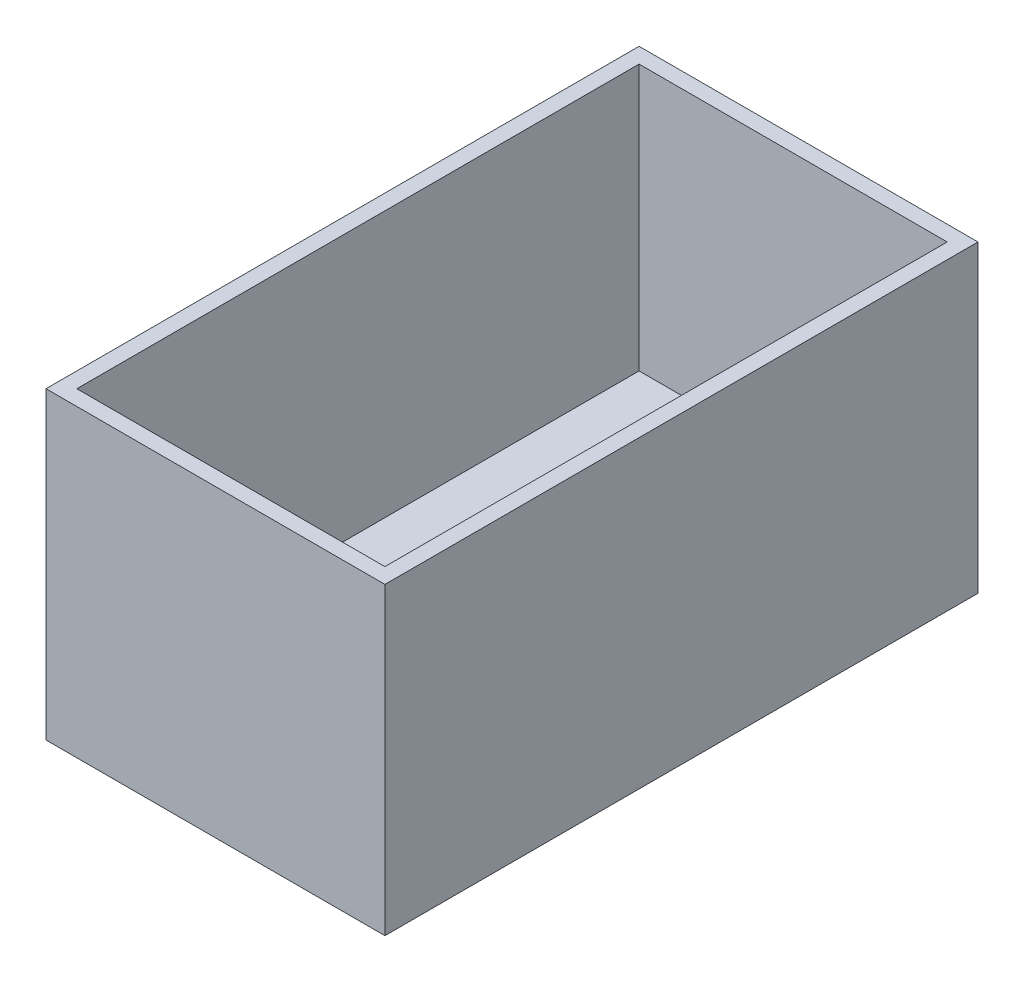
ISO-10303-21;
HEADER;
FILE_DESCRIPTION(('STEP AP214'),'2;1');
FILE_NAME('part.step','',(''),(''),'','','');
FILE_SCHEMA(('AUTOMOTIVE_DESIGN { 1 0 10303 214 1 1 1 1 }'));
ENDSEC;
DATA;
#1=APPLICATION_CONTEXT('core data for automotive mechanical design processes');
#2=APPLICATION_PROTOCOL_DEFINITION('international standard','automotive_design',2000,#1);
#3=PRODUCT_CONTEXT('',#1,'mechanical');
#4=PRODUCT('Part','Part','',(#3));
#5=PRODUCT_RELATED_PRODUCT_CATEGORY('part','',(#4));
#6=PRODUCT_DEFINITION_FORMATION('','',#4);
#7=PRODUCT_DEFINITION_CONTEXT('part definition',#1,'design');
#8=PRODUCT_DEFINITION('design','',#6,#7);
#9=PRODUCT_DEFINITION_SHAPE('','',#8);
#10=(LENGTH_UNIT() NAMED_UNIT(*) SI_UNIT(.MILLI.,.METRE.));
#11=(NAMED_UNIT(*) PLANE_ANGLE_UNIT() SI_UNIT($,.RADIAN.));
#12=(NAMED_UNIT(*) SI_UNIT($,.STERADIAN.) SOLID_ANGLE_UNIT());
#13=UNCERTAINTY_MEASURE_WITH_UNIT(LENGTH_MEASURE(1.E-05),#10,'distance_accuracy_value','');
#14=(GEOMETRIC_REPRESENTATION_CONTEXT(3) GLOBAL_UNCERTAINTY_ASSIGNED_CONTEXT((#13)) GLOBAL_UNIT_ASSIGNED_CONTEXT((#10,
#11,#12)) REPRESENTATION_CONTEXT('',''));
#15=CARTESIAN_POINT('',(0.,0.,0.));
#16=DIRECTION('',(0.,0.,1.));
#17=DIRECTION('',(1.,0.,0.));
#18=AXIS2_PLACEMENT_3D('',#15,#16,#17);
#19=CARTESIAN_POINT('',(4.171875,-37.9739583333333,26.5));
#20=DIRECTION('',(0.,1.,0.));
#21=DIRECTION('',(-1.,0.,0.));
#22=AXIS2_PLACEMENT_3D('',#19,#20,#21);
#23=CYLINDRICAL_SURFACE('',#22,2.75);
#24=CARTESIAN_POINT('',(4.171875,-32.9739583333333,26.5));
#25=DIRECTION('',(0.,1.,0.));
#26=DIRECTION('',(-1.,0.,0.));
#27=AXIS2_PLACEMENT_3D('',#24,#25,#26);
#28=CIRCLE('',#27,2.75);
#29=CARTESIAN_POINT('',(1.421875,-32.9739583333333,26.5));
#30=VERTEX_POINT('',#29);
#31=EDGE_CURVE('E328',#30,#30,#28,.T.);
#32=ORIENTED_EDGE('',*,*,#31,.F.);
#33=EDGE_LOOP('',(#32));
#34=FACE_BOUND('',#33,.T.);
#35=CARTESIAN_POINT('',(4.171875,-30.9739583333333,26.5));
#36=DIRECTION('',(0.,1.,0.));
#37=DIRECTION('',(-1.,0.,0.));
#38=AXIS2_PLACEMENT_3D('',#35,#36,#37);
#39=CIRCLE('',#38,2.75);
#40=CARTESIAN_POINT('',(1.421875,-30.9739583333333,26.5));
#41=VERTEX_POINT('',#40);
#42=EDGE_CURVE('E334',#41,#41,#39,.T.);
#43=ORIENTED_EDGE('',*,*,#42,.T.);
#44=EDGE_LOOP('',(#43));
#45=FACE_BOUND('',#44,.T.);
#46=ADVANCED_FACE('F46',(#34,#45),#23,.F.);
#47=CARTESIAN_POINT('',(4.17187500000001,-37.9739583333333,46.5));
#48=DIRECTION('',(0.,1.,0.));
#49=DIRECTION('',(-1.,0.,0.));
#50=AXIS2_PLACEMENT_3D('',#47,#48,#49);
#51=CYLINDRICAL_SURFACE('',#50,2.75);
#52=CARTESIAN_POINT('',(4.171875,-32.9739583333333,46.5));
#53=DIRECTION('',(0.,1.,0.));
#54=DIRECTION('',(-1.,0.,0.));
#55=AXIS2_PLACEMENT_3D('',#52,#53,#54);
#56=CIRCLE('',#55,2.75);
#57=CARTESIAN_POINT('',(1.421875,-32.9739583333333,46.5));
#58=VERTEX_POINT('',#57);
#59=EDGE_CURVE('E355',#58,#58,#56,.T.);
#60=ORIENTED_EDGE('',*,*,#59,.F.);
#61=EDGE_LOOP('',(#60));
#62=FACE_BOUND('',#61,.T.);
#63=CARTESIAN_POINT('',(4.171875,-30.9739583333333,46.5));
#64=DIRECTION('',(0.,1.,0.));
#65=DIRECTION('',(-1.,0.,0.));
#66=AXIS2_PLACEMENT_3D('',#63,#64,#65);
#67=CIRCLE('',#66,2.75);
#68=CARTESIAN_POINT('',(1.421875,-30.9739583333333,46.5));
#69=VERTEX_POINT('',#68);
#70=EDGE_CURVE('E318',#69,#69,#67,.T.);
#71=ORIENTED_EDGE('',*,*,#70,.T.);
#72=EDGE_LOOP('',(#71));
#73=FACE_BOUND('',#72,.T.);
#74=ADVANCED_FACE('F199',(#62,#73),#51,.F.);
#75=CARTESIAN_POINT('',(4.171875,-37.9739583333333,11.5));
#76=DIRECTION('',(0.,1.,0.));
#77=DIRECTION('',(-1.,0.,0.));
#78=AXIS2_PLACEMENT_3D('',#75,#76,#77);
#79=CYLINDRICAL_SURFACE('',#78,2.75);
#80=CARTESIAN_POINT('',(4.171875,-32.9739583333333,11.5));
#81=DIRECTION('',(0.,1.,0.));
#82=DIRECTION('',(-1.,0.,0.));
#83=AXIS2_PLACEMENT_3D('',#80,#81,#82);
#84=CIRCLE('',#83,2.75);
#85=CARTESIAN_POINT('',(1.421875,-32.9739583333333,11.5));
#86=VERTEX_POINT('',#85);
#87=EDGE_CURVE('E357',#86,#86,#84,.T.);
#88=ORIENTED_EDGE('',*,*,#87,.F.);
#89=EDGE_LOOP('',(#88));
#90=FACE_BOUND('',#89,.T.);
#91=CARTESIAN_POINT('',(4.171875,-30.9739583333333,11.5));
#92=DIRECTION('',(0.,1.,0.));
#93=DIRECTION('',(-1.,0.,0.));
#94=AXIS2_PLACEMENT_3D('',#91,#92,#93);
#95=CIRCLE('',#94,2.75);
#96=CARTESIAN_POINT('',(1.421875,-30.9739583333333,11.5));
#97=VERTEX_POINT('',#96);
#98=EDGE_CURVE('E342',#97,#97,#95,.T.);
#99=ORIENTED_EDGE('',*,*,#98,.T.);
#100=EDGE_LOOP('',(#99));
#101=FACE_BOUND('',#100,.T.);
#102=ADVANCED_FACE('F205',(#90,#101),#79,.F.);
#103=CARTESIAN_POINT('',(4.17187500000001,-37.9739583333333,61.5));
#104=DIRECTION('',(0.,1.,0.));
#105=DIRECTION('',(-1.,0.,0.));
#106=AXIS2_PLACEMENT_3D('',#103,#104,#105);
#107=CYLINDRICAL_SURFACE('',#106,2.75);
#108=CARTESIAN_POINT('',(4.17187500000001,-32.9739583333333,61.5));
#109=DIRECTION('',(0.,1.,0.));
#110=DIRECTION('',(-1.,0.,0.));
#111=AXIS2_PLACEMENT_3D('',#108,#109,#110);
#112=CIRCLE('',#111,2.75);
#113=CARTESIAN_POINT('',(1.42187500000001,-32.9739583333333,61.5));
#114=VERTEX_POINT('',#113);
#115=EDGE_CURVE('E132',#114,#114,#112,.T.);
#116=ORIENTED_EDGE('',*,*,#115,.F.);
#117=EDGE_LOOP('',(#116));
#118=FACE_BOUND('',#117,.T.);
#119=CARTESIAN_POINT('',(4.17187500000001,-30.9739583333333,61.5));
#120=DIRECTION('',(0.,1.,0.));
#121=DIRECTION('',(-1.,0.,0.));
#122=AXIS2_PLACEMENT_3D('',#119,#120,#121);
#123=CIRCLE('',#122,2.75);
#124=CARTESIAN_POINT('',(1.42187500000001,-30.9739583333333,61.5));
#125=VERTEX_POINT('',#124);
#126=EDGE_CURVE('E315',#125,#125,#123,.T.);
#127=ORIENTED_EDGE('',*,*,#126,.T.);
#128=EDGE_LOOP('',(#127));
#129=FACE_BOUND('',#128,.T.);
#130=ADVANCED_FACE('F212',(#118,#129),#107,.F.);
#131=CARTESIAN_POINT('',(-17.828125,6.52604166666667,73.));
#132=DIRECTION('',(1.,0.,0.));
#133=DIRECTION('',(0.,1.,0.));
#134=AXIS2_PLACEMENT_3D('',#131,#132,#133);
#135=PLANE('',#134);
#136=DIRECTION('',(0.,0.,-1.));
#137=VECTOR('',#136,1.);
#138=CARTESIAN_POINT('',(-17.828125,6.52604166666667,73.));
#139=LINE('',#138,#137);
#140=CARTESIAN_POINT('',(-17.828125,6.52604166666667,75.));
#141=VERTEX_POINT('',#140);
#142=CARTESIAN_POINT('',(-17.828125,6.52604166666667,-2.));
#143=VERTEX_POINT('',#142);
#144=EDGE_CURVE('E12',#141,#143,#139,.T.);
#145=ORIENTED_EDGE('',*,*,#144,.T.);
#146=DIRECTION('',(0.,1.,0.));
#147=VECTOR('',#146,1.);
#148=CARTESIAN_POINT('',(-17.828125,-32.9739583333333,-2.));
#149=LINE('',#148,#147);
#150=CARTESIAN_POINT('',(-17.828125,-32.9739583333333,-2.));
#151=VERTEX_POINT('',#150);
#152=EDGE_CURVE('E109',#151,#143,#149,.T.);
#153=ORIENTED_EDGE('',*,*,#152,.F.);
#154=DIRECTION('',(0.,0.,-1.));
#155=VECTOR('',#154,1.);
#156=CARTESIAN_POINT('',(-17.828125,-32.9739583333333,73.));
#157=LINE('',#156,#155);
#158=CARTESIAN_POINT('',(-17.828125,-32.9739583333333,75.));
#159=VERTEX_POINT('',#158);
#160=EDGE_CURVE('E55',#159,#151,#157,.T.);
#161=ORIENTED_EDGE('',*,*,#160,.F.);
#162=DIRECTION('',(0.,-1.,0.));
#163=VECTOR('',#162,1.);
#164=CARTESIAN_POINT('',(-17.828125,6.52604166666667,75.));
#165=LINE('',#164,#163);
#166=EDGE_CURVE('E111',#141,#159,#165,.T.);
#167=ORIENTED_EDGE('',*,*,#166,.F.);
#168=EDGE_LOOP('',(#145,#153,#161,#167));
#169=FACE_BOUND('',#168,.T.);
#170=ADVANCED_FACE('F48',(#169),#135,.F.);
#171=CARTESIAN_POINT('',(-17.828125,-32.9739583333333,73.));
#172=DIRECTION('',(0.,1.,0.));
#173=DIRECTION('',(-1.,0.,0.));
#174=AXIS2_PLACEMENT_3D('',#171,#172,#173);
#175=PLANE('',#174);
#176=ORIENTED_EDGE('',*,*,#115,.T.);
#177=EDGE_LOOP('',(#176));
#178=FACE_BOUND('',#177,.T.);
#179=ORIENTED_EDGE('',*,*,#87,.T.);
#180=EDGE_LOOP('',(#179));
#181=FACE_BOUND('',#180,.T.);
#182=ORIENTED_EDGE('',*,*,#59,.T.);
#183=EDGE_LOOP('',(#182));
#184=FACE_BOUND('',#183,.T.);
#185=ORIENTED_EDGE('',*,*,#31,.T.);
#186=EDGE_LOOP('',(#185));
#187=FACE_BOUND('',#186,.T.);
#188=ORIENTED_EDGE('',*,*,#160,.T.);
#189=DIRECTION('',(-1.,0.,0.));
#190=VECTOR('',#189,1.);
#191=CARTESIAN_POINT('',(26.171875,-32.9739583333333,-2.));
#192=LINE('',#191,#190);
#193=CARTESIAN_POINT('',(26.171875,-32.9739583333333,-2.));
#194=VERTEX_POINT('',#193);
#195=EDGE_CURVE('E128',#194,#151,#192,.T.);
#196=ORIENTED_EDGE('',*,*,#195,.F.);
#197=DIRECTION('',(0.,0.,-1.));
#198=VECTOR('',#197,1.);
#199=CARTESIAN_POINT('',(26.171875,-32.9739583333333,73.));
#200=LINE('',#199,#198);
#201=CARTESIAN_POINT('',(26.171875,-32.9739583333333,75.));
#202=VERTEX_POINT('',#201);
#203=EDGE_CURVE('E179',#202,#194,#200,.T.);
#204=ORIENTED_EDGE('',*,*,#203,.F.);
#205=DIRECTION('',(1.,0.,0.));
#206=VECTOR('',#205,1.);
#207=CARTESIAN_POINT('',(-17.828125,-32.9739583333333,75.));
#208=LINE('',#207,#206);
#209=EDGE_CURVE('E141',#159,#202,#208,.T.);
#210=ORIENTED_EDGE('',*,*,#209,.F.);
#211=EDGE_LOOP('',(#188,#196,#204,#210));
#212=FACE_BOUND('',#211,.T.);
#213=ADVANCED_FACE('F182',(#178,#181,#184,#187,#212),#175,.F.);
#214=CARTESIAN_POINT('',(26.171875,-32.9739583333333,73.));
#215=DIRECTION('',(-1.,0.,0.));
#216=DIRECTION('',(0.,0.,1.));
#217=AXIS2_PLACEMENT_3D('',#214,#215,#216);
#218=PLANE('',#217);
#219=ORIENTED_EDGE('',*,*,#203,.T.);
#220=DIRECTION('',(0.,-1.,0.));
#221=VECTOR('',#220,1.);
#222=CARTESIAN_POINT('',(26.171875,6.52604166666667,-2.));
#223=LINE('',#222,#221);
#224=CARTESIAN_POINT('',(26.171875,6.52604166666667,-2.));
#225=VERTEX_POINT('',#224);
#226=EDGE_CURVE('E123',#225,#194,#223,.T.);
#227=ORIENTED_EDGE('',*,*,#226,.F.);
#228=DIRECTION('',(0.,0.,-1.));
#229=VECTOR('',#228,1.);
#230=CARTESIAN_POINT('',(26.171875,6.52604166666667,73.));
#231=LINE('',#230,#229);
#232=CARTESIAN_POINT('',(26.171875,6.52604166666667,75.));
#233=VERTEX_POINT('',#232);
#234=EDGE_CURVE('E119',#233,#225,#231,.T.);
#235=ORIENTED_EDGE('',*,*,#234,.F.);
#236=DIRECTION('',(0.,1.,0.));
#237=VECTOR('',#236,1.);
#238=CARTESIAN_POINT('',(26.171875,-32.9739583333333,75.));
#239=LINE('',#238,#237);
#240=EDGE_CURVE('E144',#202,#233,#239,.T.);
#241=ORIENTED_EDGE('',*,*,#240,.F.);
#242=EDGE_LOOP('',(#219,#227,#235,#241));
#243=FACE_BOUND('',#242,.T.);
#244=ADVANCED_FACE('F187',(#243),#218,.F.);
#245=CARTESIAN_POINT('',(26.171875,6.52604166666667,73.));
#246=DIRECTION('',(0.,-1.,0.));
#247=DIRECTION('',(0.,0.,-1.));
#248=AXIS2_PLACEMENT_3D('',#245,#246,#247);
#249=PLANE('',#248);
#250=DIRECTION('',(1.,0.,0.));
#251=VECTOR('',#250,1.);
#252=CARTESIAN_POINT('',(26.171875,6.52604166666667,-2.));
#253=LINE('',#252,#251);
#254=EDGE_CURVE('E116',#143,#225,#253,.T.);
#255=ORIENTED_EDGE('',*,*,#254,.F.);
#256=ORIENTED_EDGE('',*,*,#144,.F.);
#257=DIRECTION('',(-1.,0.,0.));
#258=VECTOR('',#257,1.);
#259=CARTESIAN_POINT('',(-17.828125,6.52604166666667,75.));
#260=LINE('',#259,#258);
#261=EDGE_CURVE('E147',#233,#141,#260,.T.);
#262=ORIENTED_EDGE('',*,*,#261,.F.);
#263=ORIENTED_EDGE('',*,*,#234,.T.);
#264=EDGE_LOOP('',(#255,#256,#262,#263));
#265=FACE_BOUND('',#264,.T.);
#266=DIRECTION('',(0.,0.,-1.));
#267=VECTOR('',#266,1.);
#268=CARTESIAN_POINT('',(-15.828125,6.52604166666667,73.));
#269=LINE('',#268,#267);
#270=CARTESIAN_POINT('',(-15.828125,6.52604166666667,73.));
#271=VERTEX_POINT('',#270);
#272=CARTESIAN_POINT('',(-15.828125,6.52604166666667,0.));
#273=VERTEX_POINT('',#272);
#274=EDGE_CURVE('E162',#271,#273,#269,.T.);
#275=ORIENTED_EDGE('',*,*,#274,.T.);
#276=DIRECTION('',(1.,0.,0.));
#277=VECTOR('',#276,1.);
#278=CARTESIAN_POINT('',(26.171875,6.52604166666667,0.));
#279=LINE('',#278,#277);
#280=CARTESIAN_POINT('',(24.171875,6.52604166666667,0.));
#281=VERTEX_POINT('',#280);
#282=EDGE_CURVE('E129',#273,#281,#279,.T.);
#283=ORIENTED_EDGE('',*,*,#282,.T.);
#284=DIRECTION('',(0.,0.,-1.));
#285=VECTOR('',#284,1.);
#286=CARTESIAN_POINT('',(24.171875,6.52604166666667,73.));
#287=LINE('',#286,#285);
#288=CARTESIAN_POINT('',(24.171875,6.52604166666667,73.));
#289=VERTEX_POINT('',#288);
#290=EDGE_CURVE('E175',#289,#281,#287,.T.);
#291=ORIENTED_EDGE('',*,*,#290,.F.);
#292=DIRECTION('',(-1.,0.,0.));
#293=VECTOR('',#292,1.);
#294=CARTESIAN_POINT('',(-17.828125,6.52604166666667,73.));
#295=LINE('',#294,#293);
#296=EDGE_CURVE('E138',#289,#271,#295,.T.);
#297=ORIENTED_EDGE('',*,*,#296,.T.);
#298=EDGE_LOOP('',(#275,#283,#291,#297));
#299=FACE_BOUND('',#298,.T.);
#300=ADVANCED_FACE('F117',(#265,#299),#249,.F.);
#301=CARTESIAN_POINT('',(24.171875,6.52604166666667,73.));
#302=DIRECTION('',(1.,0.,0.));
#303=DIRECTION('',(0.,1.,0.));
#304=AXIS2_PLACEMENT_3D('',#301,#302,#303);
#305=PLANE('',#304);
#306=DIRECTION('',(0.,-1.,0.));
#307=VECTOR('',#306,1.);
#308=CARTESIAN_POINT('',(24.171875,6.52604166666667,0.));
#309=LINE('',#308,#307);
#310=CARTESIAN_POINT('',(24.171875,-27.9739583333333,0.));
#311=VERTEX_POINT('',#310);
#312=EDGE_CURVE('E149',#281,#311,#309,.T.);
#313=ORIENTED_EDGE('',*,*,#312,.T.);
#314=DIRECTION('',(0.,0.,-1.));
#315=VECTOR('',#314,1.);
#316=CARTESIAN_POINT('',(24.171875,-27.9739583333333,73.));
#317=LINE('',#316,#315);
#318=CARTESIAN_POINT('',(24.171875,-27.9739583333333,73.));
#319=VERTEX_POINT('',#318);
#320=EDGE_CURVE('E172',#319,#311,#317,.T.);
#321=ORIENTED_EDGE('',*,*,#320,.F.);
#322=DIRECTION('',(0.,-1.,0.));
#323=VECTOR('',#322,1.);
#324=CARTESIAN_POINT('',(24.171875,6.52604166666667,73.));
#325=LINE('',#324,#323);
#326=EDGE_CURVE('E152',#289,#319,#325,.T.);
#327=ORIENTED_EDGE('',*,*,#326,.F.);
#328=ORIENTED_EDGE('',*,*,#290,.T.);
#329=EDGE_LOOP('',(#313,#321,#327,#328));
#330=FACE_BOUND('',#329,.T.);
#331=ADVANCED_FACE('F194',(#330),#305,.F.);
#332=CARTESIAN_POINT('',(24.171875,-27.9739583333333,73.));
#333=DIRECTION('',(0.,-1.,0.));
#334=DIRECTION('',(1.,0.,0.));
#335=AXIS2_PLACEMENT_3D('',#332,#333,#334);
#336=PLANE('',#335);
#337=CARTESIAN_POINT('',(4.17187500000001,-27.9739583333333,61.5));
#338=DIRECTION('',(0.,1.,0.));
#339=DIRECTION('',(-1.,0.,0.));
#340=AXIS2_PLACEMENT_3D('',#337,#338,#339);
#341=CIRCLE('',#340,5.75);
#342=CARTESIAN_POINT('',(-1.57812499999999,-27.9739583333333,61.5));
#343=VERTEX_POINT('',#342);
#344=EDGE_CURVE('E317',#343,#343,#341,.T.);
#345=ORIENTED_EDGE('',*,*,#344,.F.);
#346=EDGE_LOOP('',(#345));
#347=FACE_BOUND('',#346,.T.);
#348=CARTESIAN_POINT('',(4.171875,-27.9739583333333,46.5));
#349=DIRECTION('',(0.,1.,0.));
#350=DIRECTION('',(-1.,0.,0.));
#351=AXIS2_PLACEMENT_3D('',#348,#349,#350);
#352=CIRCLE('',#351,5.75);
#353=CARTESIAN_POINT('',(-1.578125,-27.9739583333333,46.5));
#354=VERTEX_POINT('',#353);
#355=EDGE_CURVE('E324',#354,#354,#352,.T.);
#356=ORIENTED_EDGE('',*,*,#355,.F.);
#357=EDGE_LOOP('',(#356));
#358=FACE_BOUND('',#357,.T.);
#359=CARTESIAN_POINT('',(4.171875,-27.9739583333333,26.5));
#360=DIRECTION('',(0.,1.,0.));
#361=DIRECTION('',(-1.,0.,0.));
#362=AXIS2_PLACEMENT_3D('',#359,#360,#361);
#363=CIRCLE('',#362,5.75);
#364=CARTESIAN_POINT('',(-1.578125,-27.9739583333333,26.5));
#365=VERTEX_POINT('',#364);
#366=EDGE_CURVE('E336',#365,#365,#363,.T.);
#367=ORIENTED_EDGE('',*,*,#366,.F.);
#368=EDGE_LOOP('',(#367));
#369=FACE_BOUND('',#368,.T.);
#370=CARTESIAN_POINT('',(4.171875,-27.9739583333333,11.5));
#371=DIRECTION('',(0.,1.,0.));
#372=DIRECTION('',(-1.,0.,0.));
#373=AXIS2_PLACEMENT_3D('',#370,#371,#372);
#374=CIRCLE('',#373,5.75);
#375=CARTESIAN_POINT('',(-1.578125,-27.9739583333333,11.5));
#376=VERTEX_POINT('',#375);
#377=EDGE_CURVE('E345',#376,#376,#374,.T.);
#378=ORIENTED_EDGE('',*,*,#377,.F.);
#379=EDGE_LOOP('',(#378));
#380=FACE_BOUND('',#379,.T.);
#381=DIRECTION('',(-1.,0.,0.));
#382=VECTOR('',#381,1.);
#383=CARTESIAN_POINT('',(24.171875,-27.9739583333333,0.));
#384=LINE('',#383,#382);
#385=CARTESIAN_POINT('',(-15.828125,-27.9739583333333,0.));
#386=VERTEX_POINT('',#385);
#387=EDGE_CURVE('E165',#311,#386,#384,.T.);
#388=ORIENTED_EDGE('',*,*,#387,.T.);
#389=DIRECTION('',(0.,0.,-1.));
#390=VECTOR('',#389,1.);
#391=CARTESIAN_POINT('',(-15.828125,-27.9739583333333,73.));
#392=LINE('',#391,#390);
#393=CARTESIAN_POINT('',(-15.828125,-27.9739583333333,73.));
#394=VERTEX_POINT('',#393);
#395=EDGE_CURVE('E62',#394,#386,#392,.T.);
#396=ORIENTED_EDGE('',*,*,#395,.F.);
#397=DIRECTION('',(-1.,0.,0.));
#398=VECTOR('',#397,1.);
#399=CARTESIAN_POINT('',(24.171875,-27.9739583333333,73.));
#400=LINE('',#399,#398);
#401=EDGE_CURVE('E155',#319,#394,#400,.T.);
#402=ORIENTED_EDGE('',*,*,#401,.F.);
#403=ORIENTED_EDGE('',*,*,#320,.T.);
#404=EDGE_LOOP('',(#388,#396,#402,#403));
#405=FACE_BOUND('',#404,.T.);
#406=ADVANCED_FACE('F230',(#347,#358,#369,#380,#405),#336,.F.);
#407=CARTESIAN_POINT('',(-15.828125,-27.9739583333333,73.));
#408=DIRECTION('',(-1.,0.,0.));
#409=DIRECTION('',(0.,0.,1.));
#410=AXIS2_PLACEMENT_3D('',#407,#408,#409);
#411=PLANE('',#410);
#412=DIRECTION('',(0.,1.,0.));
#413=VECTOR('',#412,1.);
#414=CARTESIAN_POINT('',(-15.828125,-27.9739583333333,0.));
#415=LINE('',#414,#413);
#416=EDGE_CURVE('E156',#386,#273,#415,.T.);
#417=ORIENTED_EDGE('',*,*,#416,.T.);
#418=ORIENTED_EDGE('',*,*,#274,.F.);
#419=DIRECTION('',(0.,1.,0.));
#420=VECTOR('',#419,1.);
#421=CARTESIAN_POINT('',(-15.828125,-27.9739583333333,73.));
#422=LINE('',#421,#420);
#423=EDGE_CURVE('E159',#394,#271,#422,.T.);
#424=ORIENTED_EDGE('',*,*,#423,.F.);
#425=ORIENTED_EDGE('',*,*,#395,.T.);
#426=EDGE_LOOP('',(#417,#418,#424,#425));
#427=FACE_BOUND('',#426,.T.);
#428=ADVANCED_FACE('F226',(#427),#411,.F.);
#429=CARTESIAN_POINT('',(0.,0.,73.));
#430=DIRECTION('',(0.,0.,1.));
#431=DIRECTION('',(1.,0.,0.));
#432=AXIS2_PLACEMENT_3D('',#429,#430,#431);
#433=PLANE('',#432);
#434=ORIENTED_EDGE('',*,*,#296,.F.);
#435=ORIENTED_EDGE('',*,*,#326,.T.);
#436=ORIENTED_EDGE('',*,*,#401,.T.);
#437=ORIENTED_EDGE('',*,*,#423,.T.);
#438=EDGE_LOOP('',(#434,#435,#436,#437));
#439=FACE_BOUND('',#438,.T.);
#440=ADVANCED_FACE('F223',(#439),#433,.F.);
#441=CARTESIAN_POINT('',(0.,0.,75.));
#442=DIRECTION('',(0.,0.,1.));
#443=DIRECTION('',(1.,0.,0.));
#444=AXIS2_PLACEMENT_3D('',#441,#442,#443);
#445=PLANE('',#444);
#446=ORIENTED_EDGE('',*,*,#166,.T.);
#447=ORIENTED_EDGE('',*,*,#209,.T.);
#448=ORIENTED_EDGE('',*,*,#240,.T.);
#449=ORIENTED_EDGE('',*,*,#261,.T.);
#450=EDGE_LOOP('',(#446,#447,#448,#449));
#451=FACE_BOUND('',#450,.T.);
#452=ADVANCED_FACE('F185',(#451),#445,.T.);
#453=CARTESIAN_POINT('',(0.,0.,0.));
#454=DIRECTION('',(0.,0.,1.));
#455=DIRECTION('',(1.,0.,0.));
#456=AXIS2_PLACEMENT_3D('',#453,#454,#455);
#457=PLANE('',#456);
#458=ORIENTED_EDGE('',*,*,#416,.F.);
#459=ORIENTED_EDGE('',*,*,#387,.F.);
#460=ORIENTED_EDGE('',*,*,#312,.F.);
#461=ORIENTED_EDGE('',*,*,#282,.F.);
#462=EDGE_LOOP('',(#458,#459,#460,#461));
#463=FACE_BOUND('',#462,.T.);
#464=ADVANCED_FACE('F217',(#463),#457,.T.);
#465=CARTESIAN_POINT('',(0.,0.,-2.));
#466=DIRECTION('',(0.,0.,1.));
#467=DIRECTION('',(1.,0.,0.));
#468=AXIS2_PLACEMENT_3D('',#465,#466,#467);
#469=PLANE('',#468);
#470=ORIENTED_EDGE('',*,*,#152,.T.);
#471=ORIENTED_EDGE('',*,*,#254,.T.);
#472=ORIENTED_EDGE('',*,*,#226,.T.);
#473=ORIENTED_EDGE('',*,*,#195,.T.);
#474=EDGE_LOOP('',(#470,#471,#472,#473));
#475=FACE_BOUND('',#474,.T.);
#476=ADVANCED_FACE('F126',(#475),#469,.F.);
#477=CARTESIAN_POINT('',(4.17187500000001,-30.9739583333333,61.5));
#478=DIRECTION('',(0.,1.,0.));
#479=DIRECTION('',(-1.,0.,0.));
#480=AXIS2_PLACEMENT_3D('',#477,#478,#479);
#481=CYLINDRICAL_SURFACE('',#480,5.75);
#482=CARTESIAN_POINT('',(4.17187500000001,-30.9739583333333,61.5));
#483=DIRECTION('',(0.,1.,0.));
#484=DIRECTION('',(-1.,0.,0.));
#485=AXIS2_PLACEMENT_3D('',#482,#483,#484);
#486=CIRCLE('',#485,5.75);
#487=CARTESIAN_POINT('',(-1.57812499999999,-30.9739583333333,61.5));
#488=VERTEX_POINT('',#487);
#489=EDGE_CURVE('E321',#488,#488,#486,.T.);
#490=ORIENTED_EDGE('',*,*,#489,.F.);
#491=EDGE_LOOP('',(#490));
#492=FACE_BOUND('',#491,.T.);
#493=ORIENTED_EDGE('',*,*,#344,.T.);
#494=EDGE_LOOP('',(#493));
#495=FACE_BOUND('',#494,.T.);
#496=ADVANCED_FACE('F216',(#492,#495),#481,.F.);
#497=CARTESIAN_POINT('',(4.17187500000001,-30.9739583333333,61.5));
#498=DIRECTION('',(0.,1.,0.));
#499=DIRECTION('',(-1.,0.,0.));
#500=AXIS2_PLACEMENT_3D('',#497,#498,#499);
#501=PLANE('',#500);
#502=ORIENTED_EDGE('',*,*,#126,.F.);
#503=EDGE_LOOP('',(#502));
#504=FACE_BOUND('',#503,.T.);
#505=ORIENTED_EDGE('',*,*,#489,.T.);
#506=EDGE_LOOP('',(#505));
#507=FACE_BOUND('',#506,.T.);
#508=ADVANCED_FACE('F388',(#504,#507),#501,.T.);
#509=CARTESIAN_POINT('',(4.171875,-30.9739583333333,11.5));
#510=DIRECTION('',(0.,1.,0.));
#511=DIRECTION('',(-1.,0.,0.));
#512=AXIS2_PLACEMENT_3D('',#509,#510,#511);
#513=CYLINDRICAL_SURFACE('',#512,5.75);
#514=CARTESIAN_POINT('',(4.171875,-30.9739583333333,11.5));
#515=DIRECTION('',(0.,1.,0.));
#516=DIRECTION('',(-1.,0.,0.));
#517=AXIS2_PLACEMENT_3D('',#514,#515,#516);
#518=CIRCLE('',#517,5.75);
#519=CARTESIAN_POINT('',(-1.578125,-30.9739583333333,11.5));
#520=VERTEX_POINT('',#519);
#521=EDGE_CURVE('E348',#520,#520,#518,.T.);
#522=ORIENTED_EDGE('',*,*,#521,.F.);
#523=EDGE_LOOP('',(#522));
#524=FACE_BOUND('',#523,.T.);
#525=ORIENTED_EDGE('',*,*,#377,.T.);
#526=EDGE_LOOP('',(#525));
#527=FACE_BOUND('',#526,.T.);
#528=ADVANCED_FACE('F386',(#524,#527),#513,.F.);
#529=CARTESIAN_POINT('',(4.171875,-30.9739583333333,11.5));
#530=DIRECTION('',(0.,1.,0.));
#531=DIRECTION('',(-1.,0.,0.));
#532=AXIS2_PLACEMENT_3D('',#529,#530,#531);
#533=PLANE('',#532);
#534=ORIENTED_EDGE('',*,*,#98,.F.);
#535=EDGE_LOOP('',(#534));
#536=FACE_BOUND('',#535,.T.);
#537=ORIENTED_EDGE('',*,*,#521,.T.);
#538=EDGE_LOOP('',(#537));
#539=FACE_BOUND('',#538,.T.);
#540=ADVANCED_FACE('F377',(#536,#539),#533,.T.);
#541=CARTESIAN_POINT('',(4.171875,-30.9739583333333,46.5));
#542=DIRECTION('',(0.,1.,0.));
#543=DIRECTION('',(-1.,0.,0.));
#544=AXIS2_PLACEMENT_3D('',#541,#542,#543);
#545=CYLINDRICAL_SURFACE('',#544,5.75);
#546=CARTESIAN_POINT('',(4.171875,-30.9739583333333,46.5));
#547=DIRECTION('',(0.,1.,0.));
#548=DIRECTION('',(-1.,0.,0.));
#549=AXIS2_PLACEMENT_3D('',#546,#547,#548);
#550=CIRCLE('',#549,5.75);
#551=CARTESIAN_POINT('',(-1.578125,-30.9739583333333,46.5));
#552=VERTEX_POINT('',#551);
#553=EDGE_CURVE('E332',#552,#552,#550,.T.);
#554=ORIENTED_EDGE('',*,*,#553,.F.);
#555=EDGE_LOOP('',(#554));
#556=FACE_BOUND('',#555,.T.);
#557=ORIENTED_EDGE('',*,*,#355,.T.);
#558=EDGE_LOOP('',(#557));
#559=FACE_BOUND('',#558,.T.);
#560=ADVANCED_FACE('F371',(#556,#559),#545,.F.);
#561=CARTESIAN_POINT('',(4.171875,-30.9739583333333,46.5));
#562=DIRECTION('',(0.,1.,0.));
#563=DIRECTION('',(-1.,0.,0.));
#564=AXIS2_PLACEMENT_3D('',#561,#562,#563);
#565=PLANE('',#564);
#566=ORIENTED_EDGE('',*,*,#70,.F.);
#567=EDGE_LOOP('',(#566));
#568=FACE_BOUND('',#567,.T.);
#569=ORIENTED_EDGE('',*,*,#553,.T.);
#570=EDGE_LOOP('',(#569));
#571=FACE_BOUND('',#570,.T.);
#572=ADVANCED_FACE('F367',(#568,#571),#565,.T.);
#573=CARTESIAN_POINT('',(4.171875,-30.9739583333333,26.5));
#574=DIRECTION('',(0.,1.,0.));
#575=DIRECTION('',(-1.,0.,0.));
#576=AXIS2_PLACEMENT_3D('',#573,#574,#575);
#577=CYLINDRICAL_SURFACE('',#576,5.75);
#578=CARTESIAN_POINT('',(4.171875,-30.9739583333333,26.5));
#579=DIRECTION('',(0.,1.,0.));
#580=DIRECTION('',(-1.,0.,0.));
#581=AXIS2_PLACEMENT_3D('',#578,#579,#580);
#582=CIRCLE('',#581,5.75);
#583=CARTESIAN_POINT('',(-1.578125,-30.9739583333333,26.5));
#584=VERTEX_POINT('',#583);
#585=EDGE_CURVE('E339',#584,#584,#582,.T.);
#586=ORIENTED_EDGE('',*,*,#585,.F.);
#587=EDGE_LOOP('',(#586));
#588=FACE_BOUND('',#587,.T.);
#589=ORIENTED_EDGE('',*,*,#366,.T.);
#590=EDGE_LOOP('',(#589));
#591=FACE_BOUND('',#590,.T.);
#592=ADVANCED_FACE('F370',(#588,#591),#577,.F.);
#593=CARTESIAN_POINT('',(4.171875,-30.9739583333333,26.5));
#594=DIRECTION('',(0.,1.,0.));
#595=DIRECTION('',(-1.,0.,0.));
#596=AXIS2_PLACEMENT_3D('',#593,#594,#595);
#597=PLANE('',#596);
#598=ORIENTED_EDGE('',*,*,#42,.F.);
#599=EDGE_LOOP('',(#598));
#600=FACE_BOUND('',#599,.T.);
#601=ORIENTED_EDGE('',*,*,#585,.T.);
#602=EDGE_LOOP('',(#601));
#603=FACE_BOUND('',#602,.T.);
#604=ADVANCED_FACE('F400',(#600,#603),#597,.T.);
#605=CLOSED_SHELL('',(#46,#74,#102,#130,#170,#213,#244,#300,#331,#406,#428,#440,#452,#464,#476,
#496,#508,#528,#540,#560,#572,#592,#604));
#606=MANIFOLD_SOLID_BREP('B2',#605);
#607=ADVANCED_BREP_SHAPE_REPRESENTATION('',(#18,#606),#14);
#608=SHAPE_DEFINITION_REPRESENTATION(#9,#607);
ENDSEC;
END-ISO-10303-21;
